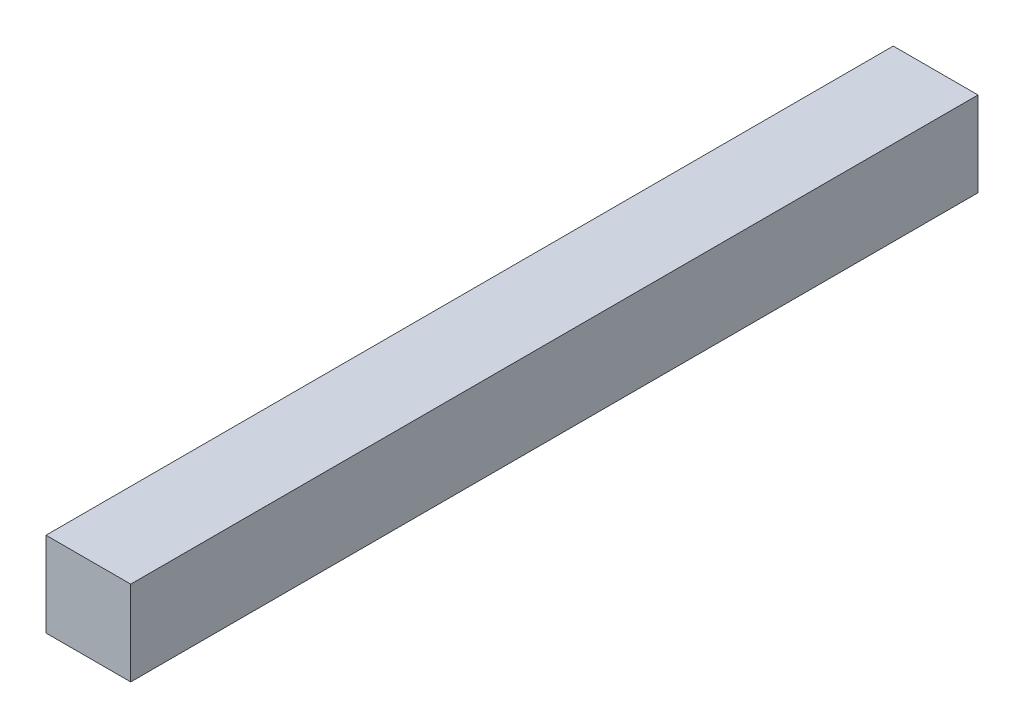
ISO-10303-21;
HEADER;
FILE_DESCRIPTION(('STEP AP214'),'2;1');
FILE_NAME('part.step','',(''),(''),'','','');
FILE_SCHEMA(('AUTOMOTIVE_DESIGN { 1 0 10303 214 1 1 1 1 }'));
ENDSEC;
DATA;
#1=APPLICATION_CONTEXT('core data for automotive mechanical design processes');
#2=APPLICATION_PROTOCOL_DEFINITION('international standard','automotive_design',2000,#1);
#3=PRODUCT_CONTEXT('',#1,'mechanical');
#4=PRODUCT('Part','Part','',(#3));
#5=PRODUCT_RELATED_PRODUCT_CATEGORY('part','',(#4));
#6=PRODUCT_DEFINITION_FORMATION('','',#4);
#7=PRODUCT_DEFINITION_CONTEXT('part definition',#1,'design');
#8=PRODUCT_DEFINITION('design','',#6,#7);
#9=PRODUCT_DEFINITION_SHAPE('','',#8);
#10=(LENGTH_UNIT() NAMED_UNIT(*) SI_UNIT(.MILLI.,.METRE.));
#11=(NAMED_UNIT(*) PLANE_ANGLE_UNIT() SI_UNIT($,.RADIAN.));
#12=(NAMED_UNIT(*) SI_UNIT($,.STERADIAN.) SOLID_ANGLE_UNIT());
#13=UNCERTAINTY_MEASURE_WITH_UNIT(LENGTH_MEASURE(1.E-05),#10,'distance_accuracy_value','');
#14=(GEOMETRIC_REPRESENTATION_CONTEXT(3) GLOBAL_UNCERTAINTY_ASSIGNED_CONTEXT((#13)) GLOBAL_UNIT_ASSIGNED_CONTEXT((#10,
#11,#12)) REPRESENTATION_CONTEXT('',''));
#15=CARTESIAN_POINT('',(0.,0.,0.));
#16=DIRECTION('',(0.,0.,1.));
#17=DIRECTION('',(1.,0.,0.));
#18=AXIS2_PLACEMENT_3D('',#15,#16,#17);
#19=CARTESIAN_POINT('',(-3.175,-3.175,31.75));
#20=DIRECTION('',(1.,0.,0.));
#21=DIRECTION('',(0.,0.,-1.));
#22=AXIS2_PLACEMENT_3D('',#19,#20,#21);
#23=PLANE('',#22);
#24=DIRECTION('',(0.,-1.,0.));
#25=VECTOR('',#24,1.);
#26=CARTESIAN_POINT('',(-3.175,-3.175,-31.75));
#27=LINE('',#26,#25);
#28=CARTESIAN_POINT('',(-3.175,3.175,-31.75));
#29=VERTEX_POINT('',#28);
#30=CARTESIAN_POINT('',(-3.175,-3.175,-31.75));
#31=VERTEX_POINT('',#30);
#32=EDGE_CURVE('E96',#29,#31,#27,.T.);
#33=ORIENTED_EDGE('',*,*,#32,.T.);
#34=DIRECTION('',(0.,0.,-1.));
#35=VECTOR('',#34,1.);
#36=CARTESIAN_POINT('',(-3.175,-3.175,31.75));
#37=LINE('',#36,#35);
#38=CARTESIAN_POINT('',(-3.175,-3.175,31.75));
#39=VERTEX_POINT('',#38);
#40=EDGE_CURVE('E11',#39,#31,#37,.T.);
#41=ORIENTED_EDGE('',*,*,#40,.F.);
#42=DIRECTION('',(0.,-1.,0.));
#43=VECTOR('',#42,1.);
#44=CARTESIAN_POINT('',(-3.175,-3.175,31.75));
#45=LINE('',#44,#43);
#46=CARTESIAN_POINT('',(-3.175,3.175,31.75));
#47=VERTEX_POINT('',#46);
#48=EDGE_CURVE('E84',#47,#39,#45,.T.);
#49=ORIENTED_EDGE('',*,*,#48,.F.);
#50=DIRECTION('',(0.,0.,-1.));
#51=VECTOR('',#50,1.);
#52=CARTESIAN_POINT('',(-3.175,3.175,31.75));
#53=LINE('',#52,#51);
#54=EDGE_CURVE('E92',#47,#29,#53,.T.);
#55=ORIENTED_EDGE('',*,*,#54,.T.);
#56=EDGE_LOOP('',(#33,#41,#49,#55));
#57=FACE_BOUND('',#56,.T.);
#58=ADVANCED_FACE('F33',(#57),#23,.F.);
#59=CARTESIAN_POINT('',(3.175,-3.175,31.75));
#60=DIRECTION('',(0.,1.,0.));
#61=DIRECTION('',(-1.,0.,0.));
#62=AXIS2_PLACEMENT_3D('',#59,#60,#61);
#63=PLANE('',#62);
#64=DIRECTION('',(1.,0.,0.));
#65=VECTOR('',#64,1.);
#66=CARTESIAN_POINT('',(3.175,-3.175,-31.75));
#67=LINE('',#66,#65);
#68=CARTESIAN_POINT('',(3.175,-3.175,-31.75));
#69=VERTEX_POINT('',#68);
#70=EDGE_CURVE('E88',#31,#69,#67,.T.);
#71=ORIENTED_EDGE('',*,*,#70,.T.);
#72=DIRECTION('',(0.,0.,-1.));
#73=VECTOR('',#72,1.);
#74=CARTESIAN_POINT('',(3.175,-3.175,31.75));
#75=LINE('',#74,#73);
#76=CARTESIAN_POINT('',(3.175,-3.175,31.75));
#77=VERTEX_POINT('',#76);
#78=EDGE_CURVE('E41',#77,#69,#75,.T.);
#79=ORIENTED_EDGE('',*,*,#78,.F.);
#80=DIRECTION('',(1.,0.,0.));
#81=VECTOR('',#80,1.);
#82=CARTESIAN_POINT('',(3.175,-3.175,31.75));
#83=LINE('',#82,#81);
#84=EDGE_CURVE('E79',#39,#77,#83,.T.);
#85=ORIENTED_EDGE('',*,*,#84,.F.);
#86=ORIENTED_EDGE('',*,*,#40,.T.);
#87=EDGE_LOOP('',(#71,#79,#85,#86));
#88=FACE_BOUND('',#87,.T.);
#89=ADVANCED_FACE('F87',(#88),#63,.F.);
#90=CARTESIAN_POINT('',(3.175,-3.175,31.75));
#91=DIRECTION('',(-1.,0.,0.));
#92=DIRECTION('',(0.,0.,1.));
#93=AXIS2_PLACEMENT_3D('',#90,#91,#92);
#94=PLANE('',#93);
#95=DIRECTION('',(0.,1.,0.));
#96=VECTOR('',#95,1.);
#97=CARTESIAN_POINT('',(3.175,-3.175,-31.75));
#98=LINE('',#97,#96);
#99=CARTESIAN_POINT('',(3.175,3.175,-31.75));
#100=VERTEX_POINT('',#99);
#101=EDGE_CURVE('E66',#69,#100,#98,.T.);
#102=ORIENTED_EDGE('',*,*,#101,.T.);
#103=DIRECTION('',(0.,0.,-1.));
#104=VECTOR('',#103,1.);
#105=CARTESIAN_POINT('',(3.175,3.175,31.75));
#106=LINE('',#105,#104);
#107=CARTESIAN_POINT('',(3.175,3.175,31.75));
#108=VERTEX_POINT('',#107);
#109=EDGE_CURVE('E89',#108,#100,#106,.T.);
#110=ORIENTED_EDGE('',*,*,#109,.F.);
#111=DIRECTION('',(0.,1.,0.));
#112=VECTOR('',#111,1.);
#113=CARTESIAN_POINT('',(3.175,-3.175,31.75));
#114=LINE('',#113,#112);
#115=EDGE_CURVE('E82',#77,#108,#114,.T.);
#116=ORIENTED_EDGE('',*,*,#115,.F.);
#117=ORIENTED_EDGE('',*,*,#78,.T.);
#118=EDGE_LOOP('',(#102,#110,#116,#117));
#119=FACE_BOUND('',#118,.T.);
#120=ADVANCED_FACE('F90',(#119),#94,.F.);
#121=CARTESIAN_POINT('',(3.175,3.175,31.75));
#122=DIRECTION('',(0.,-1.,0.));
#123=DIRECTION('',(1.,0.,0.));
#124=AXIS2_PLACEMENT_3D('',#121,#122,#123);
#125=PLANE('',#124);
#126=DIRECTION('',(-1.,0.,0.));
#127=VECTOR('',#126,1.);
#128=CARTESIAN_POINT('',(3.175,3.175,-31.75));
#129=LINE('',#128,#127);
#130=EDGE_CURVE('E72',#100,#29,#129,.T.);
#131=ORIENTED_EDGE('',*,*,#130,.T.);
#132=ORIENTED_EDGE('',*,*,#54,.F.);
#133=DIRECTION('',(-1.,0.,0.));
#134=VECTOR('',#133,1.);
#135=CARTESIAN_POINT('',(3.175,3.175,31.75));
#136=LINE('',#135,#134);
#137=EDGE_CURVE('E49',#108,#47,#136,.T.);
#138=ORIENTED_EDGE('',*,*,#137,.F.);
#139=ORIENTED_EDGE('',*,*,#109,.T.);
#140=EDGE_LOOP('',(#131,#132,#138,#139));
#141=FACE_BOUND('',#140,.T.);
#142=ADVANCED_FACE('F103',(#141),#125,.F.);
#143=CARTESIAN_POINT('',(0.,0.,31.75));
#144=DIRECTION('',(0.,0.,1.));
#145=DIRECTION('',(1.,0.,0.));
#146=AXIS2_PLACEMENT_3D('',#143,#144,#145);
#147=PLANE('',#146);
#148=ORIENTED_EDGE('',*,*,#48,.T.);
#149=ORIENTED_EDGE('',*,*,#84,.T.);
#150=ORIENTED_EDGE('',*,*,#115,.T.);
#151=ORIENTED_EDGE('',*,*,#137,.T.);
#152=EDGE_LOOP('',(#148,#149,#150,#151));
#153=FACE_BOUND('',#152,.T.);
#154=ADVANCED_FACE('F80',(#153),#147,.T.);
#155=CARTESIAN_POINT('',(0.,0.,-31.75));
#156=DIRECTION('',(0.,0.,1.));
#157=DIRECTION('',(1.,0.,0.));
#158=AXIS2_PLACEMENT_3D('',#155,#156,#157);
#159=PLANE('',#158);
#160=ORIENTED_EDGE('',*,*,#32,.F.);
#161=ORIENTED_EDGE('',*,*,#130,.F.);
#162=ORIENTED_EDGE('',*,*,#101,.F.);
#163=ORIENTED_EDGE('',*,*,#70,.F.);
#164=EDGE_LOOP('',(#160,#161,#162,#163));
#165=FACE_BOUND('',#164,.T.);
#166=ADVANCED_FACE('F106',(#165),#159,.F.);
#167=CLOSED_SHELL('',(#58,#89,#120,#142,#154,#166));
#168=MANIFOLD_SOLID_BREP('B2',#167);
#169=ADVANCED_BREP_SHAPE_REPRESENTATION('',(#18,#168),#14);
#170=SHAPE_DEFINITION_REPRESENTATION(#9,#169);
ENDSEC;
END-ISO-10303-21;
